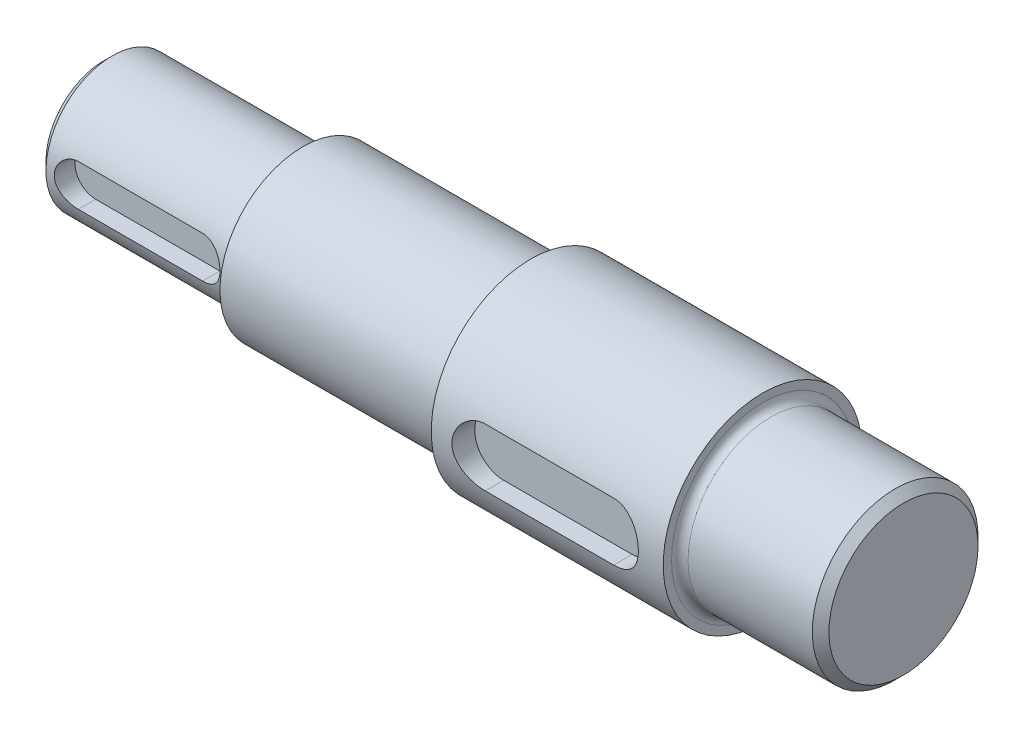
ISO-10303-21;
HEADER;
FILE_DESCRIPTION(('STEP AP214'),'2;1');
FILE_NAME('part.step','',(''),(''),'','','');
FILE_SCHEMA(('AUTOMOTIVE_DESIGN { 1 0 10303 214 1 1 1 1 }'));
ENDSEC;
DATA;
#1=APPLICATION_CONTEXT('core data for automotive mechanical design processes');
#2=APPLICATION_PROTOCOL_DEFINITION('international standard','automotive_design',2000,#1);
#3=PRODUCT_CONTEXT('',#1,'mechanical');
#4=PRODUCT('Part','Part','',(#3));
#5=PRODUCT_RELATED_PRODUCT_CATEGORY('part','',(#4));
#6=PRODUCT_DEFINITION_FORMATION('','',#4);
#7=PRODUCT_DEFINITION_CONTEXT('part definition',#1,'design');
#8=PRODUCT_DEFINITION('design','',#6,#7);
#9=PRODUCT_DEFINITION_SHAPE('','',#8);
#10=(LENGTH_UNIT() NAMED_UNIT(*) SI_UNIT(.MILLI.,.METRE.));
#11=(NAMED_UNIT(*) PLANE_ANGLE_UNIT() SI_UNIT($,.RADIAN.));
#12=(NAMED_UNIT(*) SI_UNIT($,.STERADIAN.) SOLID_ANGLE_UNIT());
#13=UNCERTAINTY_MEASURE_WITH_UNIT(LENGTH_MEASURE(1.E-05),#10,'distance_accuracy_value','');
#14=(GEOMETRIC_REPRESENTATION_CONTEXT(3) GLOBAL_UNCERTAINTY_ASSIGNED_CONTEXT((#13)) GLOBAL_UNIT_ASSIGNED_CONTEXT((#10,
#11,#12)) REPRESENTATION_CONTEXT('',''));
#15=CARTESIAN_POINT('',(0.,0.,0.));
#16=DIRECTION('',(0.,0.,1.));
#17=DIRECTION('',(1.,0.,0.));
#18=AXIS2_PLACEMENT_3D('',#15,#16,#17);
#19=CARTESIAN_POINT('',(0.,0.,0.));
#20=DIRECTION('',(-1.,0.,0.));
#21=DIRECTION('',(0.,-1.,0.));
#22=AXIS2_PLACEMENT_3D('',#19,#20,#21);
#23=PLANE('',#22);
#24=CARTESIAN_POINT('',(0.,0.,0.));
#25=DIRECTION('',(-1.,0.,0.));
#26=DIRECTION('',(0.,-1.,0.));
#27=AXIS2_PLACEMENT_3D('',#24,#25,#26);
#28=CIRCLE('',#27,14.);
#29=CARTESIAN_POINT('',(0.,-14.,0.));
#30=VERTEX_POINT('',#29);
#31=EDGE_CURVE('E162',#30,#30,#28,.T.);
#32=ORIENTED_EDGE('',*,*,#31,.T.);
#33=EDGE_LOOP('',(#32));
#34=FACE_BOUND('',#33,.T.);
#35=ADVANCED_FACE('F33',(#34),#23,.T.);
#36=CARTESIAN_POINT('',(193.,0.,0.));
#37=DIRECTION('',(1.,0.,0.));
#38=DIRECTION('',(0.,1.,0.));
#39=AXIS2_PLACEMENT_3D('',#36,#37,#38);
#40=CYLINDRICAL_SURFACE('',#39,16.);
#41=CARTESIAN_POINT('',(39.,-5.,15.1986841535706));
#42=CARTESIAN_POINT('',(39.1369297177379,-5.00001876402018,15.1986635060155));
#43=CARTESIAN_POINT('',(39.2738515786107,-4.99437589347759,15.2005339376472));
#44=CARTESIAN_POINT('',(39.5466441616812,-4.9719066012981,15.2079058985265));
#45=CARTESIAN_POINT('',(39.6825151292311,-4.95508287500206,15.2134065526431));
#46=CARTESIAN_POINT('',(39.9518756253299,-4.91045141983464,15.2278686056186));
#47=CARTESIAN_POINT('',(40.0853705652593,-4.88267328245064,15.2368206796073));
#48=CARTESIAN_POINT('',(40.3494121913658,-4.81639022533697,15.2579029145887));
#49=CARTESIAN_POINT('',(40.479958789781,-4.77788498675236,15.2700331700498));
#50=CARTESIAN_POINT('',(40.7371387356005,-4.69049837729811,15.2971014107057));
#51=CARTESIAN_POINT('',(40.8637746349516,-4.64162394412445,15.3120375178334));
#52=CARTESIAN_POINT('',(41.1124230254503,-4.5338788859812,15.3442856115609));
#53=CARTESIAN_POINT('',(41.2344337738436,-4.47500453795589,15.3615984825887));
#54=CARTESIAN_POINT('',(41.5923890679799,-4.28398711580932,15.4163884767028));
#55=CARTESIAN_POINT('',(41.8203916857905,-4.13740351463561,15.4567319869187));
#56=CARTESIAN_POINT('',(42.2559520827829,-3.80477014396878,15.5420083062615));
#57=CARTESIAN_POINT('',(42.4626585082763,-3.61763914961478,15.5870445200358));
#58=CARTESIAN_POINT('',(42.8423676526895,-3.21145982301367,15.6757673694125));
#59=CARTESIAN_POINT('',(43.0153645727234,-2.99240601054464,15.7194537717275));
#60=CARTESIAN_POINT('',(43.3264503978223,-2.52249761762138,15.8017432610086));
#61=CARTESIAN_POINT('',(43.4636611267965,-2.27103576512448,15.8402090039262));
#62=CARTESIAN_POINT('',(43.6935071381779,-1.74720631304676,15.9065031203034));
#63=CARTESIAN_POINT('',(43.7861546815474,-1.47484448775402,15.9343344192537));
#64=CARTESIAN_POINT('',(43.921404023007,-0.925860089211049,15.9754868433124));
#65=CARTESIAN_POINT('',(43.9654621090383,-0.649628435012774,15.989229278753));
#66=CARTESIAN_POINT('',(44.0068974314688,-0.0933690149137175,16.0021438524195));
#67=CARTESIAN_POINT('',(44.0042843325814,0.186657953048527,16.0013190072522));
#68=CARTESIAN_POINT('',(43.9534065239998,0.732299589546382,15.9854845726588));
#69=CARTESIAN_POINT('',(43.9067212697878,0.998078033880906,15.9709657627342));
#70=CARTESIAN_POINT('',(43.7716196828297,1.51781473163231,15.9299791073477));
#71=CARTESIAN_POINT('',(43.6832011065194,1.77177234876053,15.9035106194799));
#72=CARTESIAN_POINT('',(43.4661161738423,2.26431537219272,15.8409378140145));
#73=CARTESIAN_POINT('',(43.3369700371082,2.50267435181536,15.8047194262738));
#74=CARTESIAN_POINT('',(43.0425232216915,2.95480608942299,15.726470010495));
#75=CARTESIAN_POINT('',(42.8772137804566,3.16857286940456,15.6844375745929));
#76=CARTESIAN_POINT('',(42.5068863322796,3.57495597883695,15.5969449434458));
#77=CARTESIAN_POINT('',(42.3005029256289,3.76632311133059,15.5514148920093));
#78=CARTESIAN_POINT('',(41.9689743734189,4.02553989626261,15.4855747041344));
#79=CARTESIAN_POINT('',(41.8547196773283,4.10735324144972,15.464023127535));
#80=CARTESIAN_POINT('',(41.6195614218216,4.2611738972957,15.4223452821405));
#81=CARTESIAN_POINT('',(41.4986604849244,4.33318503733555,15.4022184582275));
#82=CARTESIAN_POINT('',(41.249466774637,4.46768370741089,15.3637482945824));
#83=CARTESIAN_POINT('',(41.1211019815447,4.53004475183006,15.3454296242414));
#84=CARTESIAN_POINT('',(40.8592633981691,4.64365087484839,15.3114343470153));
#85=CARTESIAN_POINT('',(40.7257917379939,4.69490052987992,15.2957566529907));
#86=CARTESIAN_POINT('',(40.4547920818445,4.78581076137361,15.2675565411668));
#87=CARTESIAN_POINT('',(40.3172685736427,4.82548366541208,15.2550307689955));
#88=CARTESIAN_POINT('',(40.039118633416,4.89292357731495,15.2335336556111));
#89=CARTESIAN_POINT('',(39.8984936584496,4.92069605575214,15.2245606813372));
#90=CARTESIAN_POINT('',(39.6316869336986,4.96155201839676,15.2112927618778));
#91=CARTESIAN_POINT('',(39.5057286808262,4.97596872830391,15.2065749583153));
#92=CARTESIAN_POINT('',(39.2531834848566,4.9951923004764,15.2002655216957));
#93=CARTESIAN_POINT('',(39.1265976837226,5.00001273345968,15.1986694740171));
#94=CARTESIAN_POINT('',(39.,5.,15.1986841535706));
#95=B_SPLINE_CURVE_WITH_KNOTS('',3,(#41,#42,#43,#44,#45,#46,#47,#48,#49,#50,#51,#52,#53,#54,#55,
#56,#57,#58,#59,#60,#61,#62,#63,#64,#65,#66,#67,#68,#69,#70,#71,#72,#73,#74,#75,#76,#77,#78,#79,
#80,#81,#82,#83,#84,#85,#86,#87,#88,#89,#90,#91,#92,#93,#94),.UNSPECIFIED.,.F.,.F.,(4,2,2,2,2,2,
2,2,2,2,2,2,2,2,2,2,2,2,2,2,2,2,2,2,2,2,4),(0.,0.410647919758043,0.821196881542668,
1.23064432922751,1.64010394872541,2.04929047101912,2.45862967230994,3.2768827913103,
4.12046514534441,4.96419248897058,5.82700574327198,6.6895814701031,7.52553600517322,
8.36131743199138,9.16823951381226,9.97520498033131,10.7920560572179,11.609105280929,
12.4601312020614,12.8862315051731,13.3121648650028,13.7432787284905,14.1742146909751,
14.6046900798641,15.0349673682784,15.4151752920152,15.7948451560185),.UNSPECIFIED.);
#96=CARTESIAN_POINT('',(39.,-5.,15.1986841535706));
#97=VERTEX_POINT('',#96);
#98=CARTESIAN_POINT('',(39.,5.,15.1986841535706));
#99=VERTEX_POINT('',#98);
#100=EDGE_CURVE('E189',#97,#99,#95,.T.);
#101=ORIENTED_EDGE('',*,*,#100,.F.);
#102=DIRECTION('',(1.,0.,0.));
#103=VECTOR('',#102,1.);
#104=CARTESIAN_POINT('',(193.,-5.,15.1986841535706));
#105=LINE('',#104,#103);
#106=CARTESIAN_POINT('',(9.,-5.,15.1986841535706));
#107=VERTEX_POINT('',#106);
#108=EDGE_CURVE('E226',#107,#97,#105,.T.);
#109=ORIENTED_EDGE('',*,*,#108,.F.);
#110=CARTESIAN_POINT('',(9.,5.,15.1986841535706));
#111=CARTESIAN_POINT('',(8.8630702822621,5.00001876402018,15.1986635060155));
#112=CARTESIAN_POINT('',(8.7261484213893,4.99437589347759,15.2005339376472));
#113=CARTESIAN_POINT('',(8.45335583831884,4.9719066012981,15.2079058985265));
#114=CARTESIAN_POINT('',(8.31748487076893,4.95508287500206,15.2134065526431));
#115=CARTESIAN_POINT('',(8.04812437467006,4.91045141983464,15.2278686056186));
#116=CARTESIAN_POINT('',(7.91462943474071,4.88267328245064,15.2368206796073));
#117=CARTESIAN_POINT('',(7.6505878086342,4.81639022533697,15.2579029145887));
#118=CARTESIAN_POINT('',(7.52004121021898,4.77788498675236,15.2700331700498));
#119=CARTESIAN_POINT('',(7.26286126439948,4.69049837729811,15.2971014107057));
#120=CARTESIAN_POINT('',(7.13622536504842,4.64162394412445,15.3120375178334));
#121=CARTESIAN_POINT('',(6.88757697454968,4.5338788859812,15.3442856115609));
#122=CARTESIAN_POINT('',(6.76556622615643,4.47500453795589,15.3615984825887));
#123=CARTESIAN_POINT('',(6.4076109320201,4.28398711580932,15.4163884767028));
#124=CARTESIAN_POINT('',(6.17960831420954,4.13740351463561,15.4567319869187));
#125=CARTESIAN_POINT('',(5.74404791721714,3.80477014396878,15.5420083062615));
#126=CARTESIAN_POINT('',(5.53734149172373,3.61763914961478,15.5870445200358));
#127=CARTESIAN_POINT('',(5.15763234731053,3.21145982301367,15.6757673694125));
#128=CARTESIAN_POINT('',(4.98463542727657,2.99240601054464,15.7194537717275));
#129=CARTESIAN_POINT('',(4.67354960217775,2.52249761762139,15.8017432610086));
#130=CARTESIAN_POINT('',(4.53633887320348,2.27103576512448,15.8402090039262));
#131=CARTESIAN_POINT('',(4.30649286182209,1.74720631304676,15.9065031203034));
#132=CARTESIAN_POINT('',(4.21384531845258,1.47484448775402,15.9343344192537));
#133=CARTESIAN_POINT('',(4.07859597699295,0.925860089211048,15.9754868433124));
#134=CARTESIAN_POINT('',(4.03453789096175,0.649628435012773,15.989229278753));
#135=CARTESIAN_POINT('',(3.99310256853123,0.0933690149137168,16.0021438524195));
#136=CARTESIAN_POINT('',(3.9957156674186,-0.186657953048528,16.0013190072522));
#137=CARTESIAN_POINT('',(4.04659347600016,-0.732299589546383,15.9854845726588));
#138=CARTESIAN_POINT('',(4.09327873021216,-0.998078033880907,15.9709657627342));
#139=CARTESIAN_POINT('',(4.22838031717034,-1.51781473163231,15.9299791073477));
#140=CARTESIAN_POINT('',(4.31679889348055,-1.77177234876053,15.9035106194799));
#141=CARTESIAN_POINT('',(4.5338838261577,-2.26431537219271,15.8409378140145));
#142=CARTESIAN_POINT('',(4.66302996289177,-2.50267435181536,15.8047194262738));
#143=CARTESIAN_POINT('',(4.95747677830852,-2.95480608942299,15.726470010495));
#144=CARTESIAN_POINT('',(5.12278621954343,-3.16857286940456,15.6844375745929));
#145=CARTESIAN_POINT('',(5.49311366772036,-3.57495597883695,15.5969449434458));
#146=CARTESIAN_POINT('',(5.69949707437115,-3.76632311133059,15.5514148920093));
#147=CARTESIAN_POINT('',(6.03102562658113,-4.02553989626261,15.4855747041344));
#148=CARTESIAN_POINT('',(6.14528032267166,-4.10735324144972,15.464023127535));
#149=CARTESIAN_POINT('',(6.38043857817843,-4.2611738972957,15.4223452821405));
#150=CARTESIAN_POINT('',(6.50133951507565,-4.33318503733555,15.4022184582275));
#151=CARTESIAN_POINT('',(6.75053322536304,-4.46768370741089,15.3637482945824));
#152=CARTESIAN_POINT('',(6.87889801845526,-4.53004475183006,15.3454296242414));
#153=CARTESIAN_POINT('',(7.14073660183092,-4.64365087484838,15.3114343470153));
#154=CARTESIAN_POINT('',(7.27420826200614,-4.69490052987992,15.2957566529907));
#155=CARTESIAN_POINT('',(7.54520791815553,-4.78581076137362,15.2675565411668));
#156=CARTESIAN_POINT('',(7.68273142635728,-4.82548366541209,15.2550307689955));
#157=CARTESIAN_POINT('',(7.960881366584,-4.89292357731496,15.2335336556111));
#158=CARTESIAN_POINT('',(8.10150634155039,-4.92069605575214,15.2245606813372));
#159=CARTESIAN_POINT('',(8.36831306630137,-4.96155201839676,15.2112927618778));
#160=CARTESIAN_POINT('',(8.49427131917377,-4.97596872830391,15.2065749583152));
#161=CARTESIAN_POINT('',(8.74681651514341,-4.9951923004764,15.2002655216957));
#162=CARTESIAN_POINT('',(8.87340231627745,-5.00001273345967,15.1986694740171));
#163=CARTESIAN_POINT('',(9.,-5.,15.1986841535706));
#164=B_SPLINE_CURVE_WITH_KNOTS('',3,(#110,#111,#112,#113,#114,#115,#116,#117,#118,#119,#120,
#121,#122,#123,#124,#125,#126,#127,#128,#129,#130,#131,#132,#133,#134,#135,#136,#137,#138,#139,
#140,#141,#142,#143,#144,#145,#146,#147,#148,#149,#150,#151,#152,#153,#154,#155,#156,#157,#158,
#159,#160,#161,#162,#163),.UNSPECIFIED.,.F.,.F.,(4,2,2,2,2,2,2,2,2,2,2,2,2,2,2,2,2,2,2,2,2,2,2,
2,2,2,4),(0.,0.410647919758039,0.821196881542667,1.23064432922751,1.64010394872541,
2.04929047101912,2.45862967230994,3.2768827913103,4.12046514534441,4.96419248897058,
5.82700574327198,6.6895814701031,7.52553600517322,8.36131743199138,9.16823951381226,
9.97520498033131,10.7920560572179,11.609105280929,12.4601312020614,12.8862315051731,
13.3121648650028,13.7432787284905,14.1742146909751,14.6046900798641,15.0349673682784,
15.4151752920152,15.7948451560185),.UNSPECIFIED.);
#165=CARTESIAN_POINT('',(9.,5.,15.1986841535706));
#166=VERTEX_POINT('',#165);
#167=EDGE_CURVE('E221',#166,#107,#164,.T.);
#168=ORIENTED_EDGE('',*,*,#167,.F.);
#169=DIRECTION('',(1.,0.,0.));
#170=VECTOR('',#169,1.);
#171=CARTESIAN_POINT('',(193.,5.,15.1986841535706));
#172=LINE('',#171,#170);
#173=EDGE_CURVE('E196',#99,#166,#172,.F.);
#174=ORIENTED_EDGE('',*,*,#173,.F.);
#175=EDGE_LOOP('',(#101,#109,#168,#174));
#176=FACE_BOUND('',#175,.T.);
#177=CARTESIAN_POINT('',(46.,0.,0.));
#178=DIRECTION('',(-1.,0.,0.));
#179=DIRECTION('',(0.,-1.,0.));
#180=AXIS2_PLACEMENT_3D('',#177,#178,#179);
#181=CIRCLE('',#180,16.);
#182=CARTESIAN_POINT('',(46.,-16.,0.));
#183=VERTEX_POINT('',#182);
#184=EDGE_CURVE('E174',#183,#183,#181,.T.);
#185=ORIENTED_EDGE('',*,*,#184,.T.);
#186=EDGE_LOOP('',(#185));
#187=FACE_BOUND('',#186,.T.);
#188=CARTESIAN_POINT('',(2.,0.,0.));
#189=DIRECTION('',(-1.,0.,0.));
#190=DIRECTION('',(0.,-1.,0.));
#191=AXIS2_PLACEMENT_3D('',#188,#189,#190);
#192=CIRCLE('',#191,16.);
#193=CARTESIAN_POINT('',(2.,-16.,0.));
#194=VERTEX_POINT('',#193);
#195=EDGE_CURVE('E159',#194,#194,#192,.F.);
#196=ORIENTED_EDGE('',*,*,#195,.T.);
#197=EDGE_LOOP('',(#196));
#198=FACE_BOUND('',#197,.T.);
#199=ADVANCED_FACE('F198',(#176,#187,#198),#40,.T.);
#200=CARTESIAN_POINT('',(48.,16.,0.));
#201=DIRECTION('',(-1.,0.,0.));
#202=DIRECTION('',(0.,-1.,0.));
#203=AXIS2_PLACEMENT_3D('',#200,#201,#202);
#204=PLANE('',#203);
#205=CARTESIAN_POINT('',(48.,0.,0.));
#206=DIRECTION('',(-1.,0.,0.));
#207=DIRECTION('',(0.,-1.,0.));
#208=AXIS2_PLACEMENT_3D('',#205,#206,#207);
#209=CIRCLE('',#208,18.);
#210=CARTESIAN_POINT('',(48.,-18.,0.));
#211=VERTEX_POINT('',#210);
#212=EDGE_CURVE('E171',#211,#211,#209,.F.);
#213=ORIENTED_EDGE('',*,*,#212,.T.);
#214=EDGE_LOOP('',(#213));
#215=FACE_BOUND('',#214,.T.);
#216=CARTESIAN_POINT('',(48.,0.,0.));
#217=DIRECTION('',(1.,0.,0.));
#218=DIRECTION('',(0.,1.,0.));
#219=AXIS2_PLACEMENT_3D('',#216,#217,#218);
#220=CIRCLE('',#219,20.);
#221=CARTESIAN_POINT('',(48.,20.,0.));
#222=VERTEX_POINT('',#221);
#223=EDGE_CURVE('E156',#222,#222,#220,.T.);
#224=ORIENTED_EDGE('',*,*,#223,.F.);
#225=EDGE_LOOP('',(#224));
#226=FACE_BOUND('',#225,.T.);
#227=ADVANCED_FACE('F281',(#215,#226),#204,.T.);
#228=CARTESIAN_POINT('',(193.,0.,0.));
#229=DIRECTION('',(1.,0.,0.));
#230=DIRECTION('',(0.,1.,0.));
#231=AXIS2_PLACEMENT_3D('',#228,#229,#230);
#232=CYLINDRICAL_SURFACE('',#231,20.);
#233=CARTESIAN_POINT('',(101.,0.,0.));
#234=DIRECTION('',(-1.,0.,0.));
#235=DIRECTION('',(0.,-1.,0.));
#236=AXIS2_PLACEMENT_3D('',#233,#234,#235);
#237=CIRCLE('',#236,20.);
#238=CARTESIAN_POINT('',(101.,-20.,0.));
#239=VERTEX_POINT('',#238);
#240=EDGE_CURVE('E180',#239,#239,#237,.T.);
#241=ORIENTED_EDGE('',*,*,#240,.T.);
#242=EDGE_LOOP('',(#241));
#243=FACE_BOUND('',#242,.T.);
#244=ORIENTED_EDGE('',*,*,#223,.T.);
#245=EDGE_LOOP('',(#244));
#246=FACE_BOUND('',#245,.T.);
#247=ADVANCED_FACE('F308',(#243,#246),#232,.T.);
#248=CARTESIAN_POINT('',(103.,20.,0.));
#249=DIRECTION('',(-1.,0.,0.));
#250=DIRECTION('',(0.,-1.,0.));
#251=AXIS2_PLACEMENT_3D('',#248,#249,#250);
#252=PLANE('',#251);
#253=CARTESIAN_POINT('',(103.,0.,0.));
#254=DIRECTION('',(-1.,0.,0.));
#255=DIRECTION('',(0.,-1.,0.));
#256=AXIS2_PLACEMENT_3D('',#253,#254,#255);
#257=CIRCLE('',#256,22.);
#258=CARTESIAN_POINT('',(103.,-22.,0.));
#259=VERTEX_POINT('',#258);
#260=EDGE_CURVE('E177',#259,#259,#257,.F.);
#261=ORIENTED_EDGE('',*,*,#260,.T.);
#262=EDGE_LOOP('',(#261));
#263=FACE_BOUND('',#262,.T.);
#264=CARTESIAN_POINT('',(103.,0.,0.));
#265=DIRECTION('',(1.,0.,0.));
#266=DIRECTION('',(0.,1.,0.));
#267=AXIS2_PLACEMENT_3D('',#264,#265,#266);
#268=CIRCLE('',#267,24.);
#269=CARTESIAN_POINT('',(103.,24.,0.));
#270=VERTEX_POINT('',#269);
#271=EDGE_CURVE('E153',#270,#270,#268,.T.);
#272=ORIENTED_EDGE('',*,*,#271,.F.);
#273=EDGE_LOOP('',(#272));
#274=FACE_BOUND('',#273,.T.);
#275=ADVANCED_FACE('F262',(#263,#274),#252,.T.);
#276=CARTESIAN_POINT('',(193.,0.,0.));
#277=DIRECTION('',(1.,0.,0.));
#278=DIRECTION('',(0.,1.,0.));
#279=AXIS2_PLACEMENT_3D('',#276,#277,#278);
#280=CYLINDRICAL_SURFACE('',#279,24.);
#281=CARTESIAN_POINT('',(146.,-7.,22.956480566498));
#282=CARTESIAN_POINT('',(146.192377017042,-7.00002575966466,22.95645389589));
#283=CARTESIAN_POINT('',(146.384744405618,-6.99207068648228,22.9588978693371));
#284=CARTESIAN_POINT('',(146.768016412493,-6.96038940268603,22.9685324694914));
#285=CARTESIAN_POINT('',(146.958921335683,-6.93666657509225,22.9757220780058));
#286=CARTESIAN_POINT('',(147.337448101452,-6.87371674659299,22.9946304639627));
#287=CARTESIAN_POINT('',(147.525076795311,-6.83452756535011,23.0063381917734));
#288=CARTESIAN_POINT('',(147.896205910115,-6.74099543191875,23.0339178389727));
#289=CARTESIAN_POINT('',(148.079706232368,-6.68665211787473,23.0497898577972));
#290=CARTESIAN_POINT('',(148.441226177189,-6.56329769920769,23.0852166974821));
#291=CARTESIAN_POINT('',(148.619248700622,-6.49429451653387,23.1047695286453));
#292=CARTESIAN_POINT('',(148.96882021787,-6.34211797948412,23.1470035642304));
#293=CARTESIAN_POINT('',(149.140366775705,-6.25893935653199,23.1696859312057));
#294=CARTESIAN_POINT('',(149.475844489878,-6.07904056277584,23.2175348468332));
#295=CARTESIAN_POINT('',(149.639775468821,-5.98232007674329,23.2427014533097));
#296=CARTESIAN_POINT('',(149.959081771007,-5.77596928247642,23.2948385691885));
#297=CARTESIAN_POINT('',(150.114453831931,-5.66633410096575,23.3218097578692));
#298=CARTESIAN_POINT('',(150.419653938051,-5.43182024859132,23.3775583295902));
#299=CARTESIAN_POINT('',(150.569225104074,-5.3066140336209,23.4063646594586));
#300=CARTESIAN_POINT('',(150.857417231184,-5.04415474403587,23.4643253900033));
#301=CARTESIAN_POINT('',(150.996034360862,-4.90689748943723,23.4934799083975));
#302=CARTESIAN_POINT('',(151.261379060091,-4.62124345801019,23.551334153623));
#303=CARTESIAN_POINT('',(151.38810658501,-4.47284663936941,23.5800338787467));
#304=CARTESIAN_POINT('',(151.628833327748,-4.16584741463492,23.6362023651967));
#305=CARTESIAN_POINT('',(151.742832642135,-4.00724508598472,23.6636711358613));
#306=CARTESIAN_POINT('',(151.959429493054,-3.67761507053094,23.7171576318518));
#307=CARTESIAN_POINT('',(152.061758137286,-3.5064041424394,23.7431361056055));
#308=CARTESIAN_POINT('',(152.251542687836,-3.15562428711047,23.7922967546624));
#309=CARTESIAN_POINT('',(152.339004075584,-2.97605847148552,23.8154799596367));
#310=CARTESIAN_POINT('',(152.498404667704,-2.60972139886196,23.8584024425949));
#311=CARTESIAN_POINT('',(152.570340905601,-2.42294877284136,23.8781410622655));
#312=CARTESIAN_POINT('',(152.69802015909,-2.04366008250954,23.9135884036831));
#313=CARTESIAN_POINT('',(152.753770112628,-1.85114651807803,23.9292988516914));
#314=CARTESIAN_POINT('',(152.847340144509,-1.46695963219767,23.9558783824457));
#315=CARTESIAN_POINT('',(152.885599833102,-1.27540151296482,23.9668656974275));
#316=CARTESIAN_POINT('',(152.945981709264,-0.889627827384881,23.9842828598795));
#317=CARTESIAN_POINT('',(152.968110296579,-0.695413346093669,23.9907145147029));
#318=CARTESIAN_POINT('',(152.996049437628,-0.305707484706372,23.9988443193323));
#319=CARTESIAN_POINT('',(153.001859352105,-0.110216054888556,24.0005422837037));
#320=CARTESIAN_POINT('',(152.997104422758,0.280548759151212,23.9991554941984));
#321=CARTESIAN_POINT('',(152.986539861613,0.475822147079082,23.9960708228865));
#322=CARTESIAN_POINT('',(152.949704826316,0.858763532682911,23.9853726262241));
#323=CARTESIAN_POINT('',(152.923920749377,1.04648248545087,23.9778993905009));
#324=CARTESIAN_POINT('',(152.85726413557,1.41906880599863,23.9587364617742));
#325=CARTESIAN_POINT('',(152.816386450306,1.60393517832813,23.9470453300869));
#326=CARTESIAN_POINT('',(152.719903423386,1.96941849285668,23.9197609510502));
#327=CARTESIAN_POINT('',(152.664303029491,2.15003684049847,23.9041690147145));
#328=CARTESIAN_POINT('',(152.538792137871,2.50595693179476,23.8694819029225));
#329=CARTESIAN_POINT('',(152.468876264634,2.68125664981075,23.8503854117738));
#330=CARTESIAN_POINT('',(152.314445165454,3.02721927819267,23.80896106074));
#331=CARTESIAN_POINT('',(152.229779507473,3.19781107480364,23.7866003326643));
#332=CARTESIAN_POINT('',(152.046975284076,3.53132644746546,23.7393789651262));
#333=CARTESIAN_POINT('',(151.948832091867,3.6942473642233,23.7145174679453));
#334=CARTESIAN_POINT('',(151.739774719816,4.01136557714415,23.662940560499));
#335=CARTESIAN_POINT('',(151.62886052128,4.16556286053639,23.6362251475197));
#336=CARTESIAN_POINT('',(151.394986495971,4.46431529273863,23.5816232052155));
#337=CARTESIAN_POINT('',(151.272026338257,4.60887017645667,23.5537366437272));
#338=CARTESIAN_POINT('',(151.01011421207,4.89258412268109,23.4964747635981));
#339=CARTESIAN_POINT('',(150.870741433699,5.03135155010395,23.4670823297621));
#340=CARTESIAN_POINT('',(150.580829611997,5.29665913789578,23.4086277473022));
#341=CARTESIAN_POINT('',(150.430294193434,5.42320323699322,23.3795654949653));
#342=CARTESIAN_POINT('',(150.118871485937,5.66335466900479,23.3225568752573));
#343=CARTESIAN_POINT('',(149.957977422517,5.77695339843099,23.2946112579195));
#344=CARTESIAN_POINT('',(149.627020752468,5.99028088545064,23.2406678033365));
#345=CARTESIAN_POINT('',(149.456961741021,6.09001502761001,23.2146692117481));
#346=CARTESIAN_POINT('',(149.107052428248,6.27581375687662,23.1651354388814));
#347=CARTESIAN_POINT('',(148.927123806809,6.36173793342892,23.1416263007237));
#348=CARTESIAN_POINT('',(148.560303511068,6.51801910772587,23.098095352465));
#349=CARTESIAN_POINT('',(148.37341470872,6.58838244492252,23.0780721229225));
#350=CARTESIAN_POINT('',(147.994146761326,6.71291098283026,23.0421576373197));
#351=CARTESIAN_POINT('',(147.801773603374,6.76709315817447,23.0262620535088));
#352=CARTESIAN_POINT('',(147.41286565597,6.85884146824021,22.9990994939156));
#353=CARTESIAN_POINT('',(147.216332835197,6.89641528688285,22.9878303778522));
#354=CARTESIAN_POINT('',(146.849895374392,6.95030205694016,22.9715911687078));
#355=CARTESIAN_POINT('',(146.680359085623,6.96894003353268,22.965935239902));
#356=CARTESIAN_POINT('',(146.340552928733,6.99378672629829,22.9583749002177));
#357=CARTESIAN_POINT('',(146.17028455135,7.00001413311573,22.9564648480198));
#358=CARTESIAN_POINT('',(146.,7.,22.956480566498));
#359=B_SPLINE_CURVE_WITH_KNOTS('',3,(#281,#282,#283,#284,#285,#286,#287,#288,#289,#290,#291,
#292,#293,#294,#295,#296,#297,#298,#299,#300,#301,#302,#303,#304,#305,#306,#307,#308,#309,#310,
#311,#312,#313,#314,#315,#316,#317,#318,#319,#320,#321,#322,#323,#324,#325,#326,#327,#328,#329,
#330,#331,#332,#333,#334,#335,#336,#337,#338,#339,#340,#341,#342,#343,#344,#345,#346,#347,#348,
#349,#350,#351,#352,#353,#354,#355,#356,#357,#358),.UNSPECIFIED.,.F.,.F.,(4,2,2,2,2,2,2,2,2,2,2,
2,2,2,2,2,2,2,2,2,2,2,2,2,2,2,2,2,2,2,2,2,2,2,2,2,2,2,4),(0.,0.576936312150283,1.15374888078415,
1.72915963089136,2.30458412202906,2.87969845068401,3.45502699972622,4.0303689435374,
4.60592868856402,5.19677636179465,5.7878297903136,6.37888543746381,6.96993659997458,
7.57263278244223,8.17510627177614,8.77769477727643,9.38002461197053,9.96624701293704,
10.5522367132199,11.1382493683848,11.7242519070611,12.2924695734608,12.8608812369626,
13.4291021201545,13.997536764898,14.5721502124455,15.1469614183888,15.7217734657935,
16.2966013096086,16.8924861271703,17.4881782874434,18.0842640636637,18.6801176884375,
19.2816911764404,19.8830191313793,20.4837140372878,21.0841307377182,21.5956008174164,
22.1063000258608),.UNSPECIFIED.);
#360=CARTESIAN_POINT('',(146.,-7.,22.956480566498));
#361=VERTEX_POINT('',#360);
#362=CARTESIAN_POINT('',(146.,7.,22.956480566498));
#363=VERTEX_POINT('',#362);
#364=EDGE_CURVE('E228',#361,#363,#359,.T.);
#365=ORIENTED_EDGE('',*,*,#364,.F.);
#366=DIRECTION('',(1.,0.,0.));
#367=VECTOR('',#366,1.);
#368=CARTESIAN_POINT('',(193.,-7.,22.956480566498));
#369=LINE('',#368,#367);
#370=CARTESIAN_POINT('',(115.,-7.,22.956480566498));
#371=VERTEX_POINT('',#370);
#372=EDGE_CURVE('E11',#371,#361,#369,.T.);
#373=ORIENTED_EDGE('',*,*,#372,.F.);
#374=CARTESIAN_POINT('',(115.,7.,22.956480566498));
#375=CARTESIAN_POINT('',(114.807622982958,7.00002575966466,22.95645389589));
#376=CARTESIAN_POINT('',(114.615255594382,6.99207068648228,22.9588978693371));
#377=CARTESIAN_POINT('',(114.231983587507,6.96038940268603,22.9685324694914));
#378=CARTESIAN_POINT('',(114.041078664317,6.93666657509226,22.9757220780058));
#379=CARTESIAN_POINT('',(113.662551898548,6.87371674659299,22.9946304639627));
#380=CARTESIAN_POINT('',(113.474923204689,6.83452756535012,23.0063381917734));
#381=CARTESIAN_POINT('',(113.103794089885,6.74099543191876,23.0339178389727));
#382=CARTESIAN_POINT('',(112.920293767632,6.68665211787473,23.0497898577972));
#383=CARTESIAN_POINT('',(112.558773822811,6.56329769920769,23.0852166974821));
#384=CARTESIAN_POINT('',(112.380751299378,6.49429451653387,23.1047695286453));
#385=CARTESIAN_POINT('',(112.03117978213,6.34211797948412,23.1470035642304));
#386=CARTESIAN_POINT('',(111.859633224295,6.25893935653199,23.1696859312057));
#387=CARTESIAN_POINT('',(111.524155510122,6.07904056277584,23.2175348468332));
#388=CARTESIAN_POINT('',(111.360224531179,5.98232007674329,23.2427014533097));
#389=CARTESIAN_POINT('',(111.040918228993,5.77596928247643,23.2948385691885));
#390=CARTESIAN_POINT('',(110.885546168069,5.66633410096576,23.3218097578692));
#391=CARTESIAN_POINT('',(110.580346061949,5.43182024859133,23.3775583295902));
#392=CARTESIAN_POINT('',(110.430774895926,5.3066140336209,23.4063646594586));
#393=CARTESIAN_POINT('',(110.142582768816,5.04415474403587,23.4643253900033));
#394=CARTESIAN_POINT('',(110.003965639138,4.90689748943723,23.4934799083975));
#395=CARTESIAN_POINT('',(109.738620939909,4.62124345801019,23.551334153623));
#396=CARTESIAN_POINT('',(109.61189341499,4.47284663936941,23.5800338787467));
#397=CARTESIAN_POINT('',(109.371166672252,4.16584741463492,23.6362023651967));
#398=CARTESIAN_POINT('',(109.257167357865,4.00724508598471,23.6636711358613));
#399=CARTESIAN_POINT('',(109.040570506946,3.67761507053094,23.7171576318518));
#400=CARTESIAN_POINT('',(108.938241862714,3.5064041424394,23.7431361056055));
#401=CARTESIAN_POINT('',(108.748457312164,3.15562428711047,23.7922967546624));
#402=CARTESIAN_POINT('',(108.660995924416,2.97605847148551,23.8154799596367));
#403=CARTESIAN_POINT('',(108.501595332296,2.60972139886195,23.8584024425949));
#404=CARTESIAN_POINT('',(108.429659094399,2.42294877284135,23.8781410622655));
#405=CARTESIAN_POINT('',(108.30197984091,2.04366008250953,23.9135884036831));
#406=CARTESIAN_POINT('',(108.246229887372,1.85114651807802,23.9292988516914));
#407=CARTESIAN_POINT('',(108.152659855491,1.46695963219767,23.9558783824457));
#408=CARTESIAN_POINT('',(108.114400166898,1.27540151296482,23.9668656974275));
#409=CARTESIAN_POINT('',(108.054018290736,0.889627827384876,23.9842828598795));
#410=CARTESIAN_POINT('',(108.031889703421,0.695413346093665,23.9907145147029));
#411=CARTESIAN_POINT('',(108.003950562372,0.30570748470637,23.9988443193323));
#412=CARTESIAN_POINT('',(107.998140647895,0.110216054888554,24.0005422837037));
#413=CARTESIAN_POINT('',(108.002895577242,-0.280548759151213,23.9991554941984));
#414=CARTESIAN_POINT('',(108.013460138387,-0.475822147079082,23.9960708228865));
#415=CARTESIAN_POINT('',(108.050295173684,-0.85876353268291,23.9853726262241));
#416=CARTESIAN_POINT('',(108.076079250623,-1.04648248545087,23.9778993905009));
#417=CARTESIAN_POINT('',(108.14273586443,-1.41906880599863,23.9587364617742));
#418=CARTESIAN_POINT('',(108.183613549694,-1.60393517832813,23.9470453300869));
#419=CARTESIAN_POINT('',(108.280096576613,-1.96941849285668,23.9197609510502));
#420=CARTESIAN_POINT('',(108.335696970509,-2.15003684049847,23.9041690147145));
#421=CARTESIAN_POINT('',(108.461207862129,-2.50595693179476,23.8694819029225));
#422=CARTESIAN_POINT('',(108.531123735366,-2.68125664981075,23.8503854117738));
#423=CARTESIAN_POINT('',(108.685554834546,-3.02721927819268,23.80896106074));
#424=CARTESIAN_POINT('',(108.770220492527,-3.19781107480365,23.7866003326643));
#425=CARTESIAN_POINT('',(108.953024715924,-3.53132644746547,23.7393789651262));
#426=CARTESIAN_POINT('',(109.051167908133,-3.6942473642233,23.7145174679453));
#427=CARTESIAN_POINT('',(109.260225280184,-4.01136557714416,23.662940560499));
#428=CARTESIAN_POINT('',(109.37113947872,-4.1655628605364,23.6362251475197));
#429=CARTESIAN_POINT('',(109.605013504029,-4.46431529273863,23.5816232052155));
#430=CARTESIAN_POINT('',(109.727973661743,-4.60887017645667,23.5537366437272));
#431=CARTESIAN_POINT('',(109.98988578793,-4.89258412268109,23.4964747635981));
#432=CARTESIAN_POINT('',(110.129258566301,-5.03135155010394,23.4670823297621));
#433=CARTESIAN_POINT('',(110.419170388003,-5.29665913789578,23.4086277473022));
#434=CARTESIAN_POINT('',(110.569705806566,-5.42320323699322,23.3795654949653));
#435=CARTESIAN_POINT('',(110.881128514063,-5.66335466900479,23.3225568752573));
#436=CARTESIAN_POINT('',(111.042022577483,-5.77695339843098,23.2946112579195));
#437=CARTESIAN_POINT('',(111.372979247532,-5.99028088545063,23.2406678033365));
#438=CARTESIAN_POINT('',(111.543038258979,-6.09001502761001,23.2146692117481));
#439=CARTESIAN_POINT('',(111.892947571752,-6.27581375687662,23.1651354388814));
#440=CARTESIAN_POINT('',(112.072876193191,-6.36173793342891,23.1416263007237));
#441=CARTESIAN_POINT('',(112.439696488932,-6.51801910772586,23.098095352465));
#442=CARTESIAN_POINT('',(112.62658529128,-6.58838244492251,23.0780721229225));
#443=CARTESIAN_POINT('',(113.005853238674,-6.71291098283026,23.0421576373197));
#444=CARTESIAN_POINT('',(113.198226396626,-6.76709315817446,23.0262620535088));
#445=CARTESIAN_POINT('',(113.58713434403,-6.8588414682402,22.9990994939156));
#446=CARTESIAN_POINT('',(113.783667164803,-6.89641528688285,22.9878303778522));
#447=CARTESIAN_POINT('',(114.150104625608,-6.95030205694016,22.9715911687078));
#448=CARTESIAN_POINT('',(114.319640914377,-6.96894003353268,22.965935239902));
#449=CARTESIAN_POINT('',(114.659447071267,-6.99378672629829,22.9583749002177));
#450=CARTESIAN_POINT('',(114.82971544865,-7.00001413311573,22.9564648480198));
#451=CARTESIAN_POINT('',(115.,-7.,22.956480566498));
#452=B_SPLINE_CURVE_WITH_KNOTS('',3,(#374,#375,#376,#377,#378,#379,#380,#381,#382,#383,#384,
#385,#386,#387,#388,#389,#390,#391,#392,#393,#394,#395,#396,#397,#398,#399,#400,#401,#402,#403,
#404,#405,#406,#407,#408,#409,#410,#411,#412,#413,#414,#415,#416,#417,#418,#419,#420,#421,#422,
#423,#424,#425,#426,#427,#428,#429,#430,#431,#432,#433,#434,#435,#436,#437,#438,#439,#440,#441,
#442,#443,#444,#445,#446,#447,#448,#449,#450,#451),.UNSPECIFIED.,.F.,.F.,(4,2,2,2,2,2,2,2,2,2,2,
2,2,2,2,2,2,2,2,2,2,2,2,2,2,2,2,2,2,2,2,2,2,2,2,2,2,2,4),(0.,0.576936312150227,1.15374888078414,
1.72915963089133,2.30458412202906,2.87969845068403,3.4550269997262,4.03036894353739,
4.60592868856402,5.19677636179463,5.78782979031361,6.37888543746382,6.9699365999746,
7.57263278244224,8.17510627177614,8.77769477727645,9.38002461197054,9.96624701293705,
10.5522367132199,11.1382493683848,11.7242519070611,12.2924695734608,12.8608812369626,
13.4291021201546,13.997536764898,14.5721502124455,15.1469614183888,15.7217734657935,
16.2966013096086,16.8924861271703,17.4881782874434,18.0842640636637,18.6801176884376,
19.2816911764404,19.8830191313792,20.4837140372878,21.0841307377182,21.5956008174165,
22.1063000258608),.UNSPECIFIED.);
#453=CARTESIAN_POINT('',(115.,7.,22.956480566498));
#454=VERTEX_POINT('',#453);
#455=EDGE_CURVE('E41',#454,#371,#452,.T.);
#456=ORIENTED_EDGE('',*,*,#455,.F.);
#457=DIRECTION('',(1.,0.,0.));
#458=VECTOR('',#457,1.);
#459=CARTESIAN_POINT('',(193.,7.,22.956480566498));
#460=LINE('',#459,#458);
#461=EDGE_CURVE('E235',#363,#454,#460,.F.);
#462=ORIENTED_EDGE('',*,*,#461,.F.);
#463=EDGE_LOOP('',(#365,#373,#456,#462));
#464=FACE_BOUND('',#463,.T.);
#465=ORIENTED_EDGE('',*,*,#271,.T.);
#466=EDGE_LOOP('',(#465));
#467=FACE_BOUND('',#466,.T.);
#468=CARTESIAN_POINT('',(159.,0.,0.));
#469=DIRECTION('',(1.,0.,0.));
#470=DIRECTION('',(0.,1.,0.));
#471=AXIS2_PLACEMENT_3D('',#468,#469,#470);
#472=CIRCLE('',#471,24.);
#473=CARTESIAN_POINT('',(159.,24.,0.));
#474=VERTEX_POINT('',#473);
#475=EDGE_CURVE('E143',#474,#474,#472,.T.);
#476=ORIENTED_EDGE('',*,*,#475,.F.);
#477=EDGE_LOOP('',(#476));
#478=FACE_BOUND('',#477,.T.);
#479=ADVANCED_FACE('F236',(#464,#467,#478),#280,.T.);
#480=CARTESIAN_POINT('',(159.,24.,0.));
#481=DIRECTION('',(1.,0.,0.));
#482=DIRECTION('',(0.,1.,0.));
#483=AXIS2_PLACEMENT_3D('',#480,#481,#482);
#484=PLANE('',#483);
#485=CARTESIAN_POINT('',(159.,0.,0.));
#486=DIRECTION('',(1.,0.,0.));
#487=DIRECTION('',(0.,1.,0.));
#488=AXIS2_PLACEMENT_3D('',#485,#486,#487);
#489=CIRCLE('',#488,22.);
#490=CARTESIAN_POINT('',(159.,22.,0.));
#491=VERTEX_POINT('',#490);
#492=EDGE_CURVE('E186',#491,#491,#489,.F.);
#493=ORIENTED_EDGE('',*,*,#492,.T.);
#494=EDGE_LOOP('',(#493));
#495=FACE_BOUND('',#494,.T.);
#496=ORIENTED_EDGE('',*,*,#475,.T.);
#497=EDGE_LOOP('',(#496));
#498=FACE_BOUND('',#497,.T.);
#499=ADVANCED_FACE('F261',(#495,#498),#484,.T.);
#500=CARTESIAN_POINT('',(193.,0.,0.));
#501=DIRECTION('',(1.,0.,0.));
#502=DIRECTION('',(0.,1.,0.));
#503=AXIS2_PLACEMENT_3D('',#500,#501,#502);
#504=CYLINDRICAL_SURFACE('',#503,20.);
#505=CARTESIAN_POINT('',(161.,0.,0.));
#506=DIRECTION('',(1.,0.,0.));
#507=DIRECTION('',(0.,1.,0.));
#508=AXIS2_PLACEMENT_3D('',#505,#506,#507);
#509=CIRCLE('',#508,20.);
#510=CARTESIAN_POINT('',(161.,20.,0.));
#511=VERTEX_POINT('',#510);
#512=EDGE_CURVE('E183',#511,#511,#509,.T.);
#513=ORIENTED_EDGE('',*,*,#512,.T.);
#514=EDGE_LOOP('',(#513));
#515=FACE_BOUND('',#514,.T.);
#516=CARTESIAN_POINT('',(191.,0.,0.));
#517=DIRECTION('',(1.,0.,0.));
#518=DIRECTION('',(0.,1.,0.));
#519=AXIS2_PLACEMENT_3D('',#516,#517,#518);
#520=CIRCLE('',#519,20.);
#521=CARTESIAN_POINT('',(191.,20.,0.));
#522=VERTEX_POINT('',#521);
#523=EDGE_CURVE('E168',#522,#522,#520,.F.);
#524=ORIENTED_EDGE('',*,*,#523,.T.);
#525=EDGE_LOOP('',(#524));
#526=FACE_BOUND('',#525,.T.);
#527=ADVANCED_FACE('F268',(#515,#526),#504,.T.);
#528=CARTESIAN_POINT('',(193.,20.,0.));
#529=DIRECTION('',(1.,0.,0.));
#530=DIRECTION('',(0.,1.,0.));
#531=AXIS2_PLACEMENT_3D('',#528,#529,#530);
#532=PLANE('',#531);
#533=CARTESIAN_POINT('',(193.,0.,0.));
#534=DIRECTION('',(1.,0.,0.));
#535=DIRECTION('',(0.,1.,0.));
#536=AXIS2_PLACEMENT_3D('',#533,#534,#535);
#537=CIRCLE('',#536,18.);
#538=CARTESIAN_POINT('',(193.,18.,0.));
#539=VERTEX_POINT('',#538);
#540=EDGE_CURVE('E165',#539,#539,#537,.T.);
#541=ORIENTED_EDGE('',*,*,#540,.T.);
#542=EDGE_LOOP('',(#541));
#543=FACE_BOUND('',#542,.T.);
#544=ADVANCED_FACE('F219',(#543),#532,.T.);
#545=CARTESIAN_POINT('',(2.,0.,0.));
#546=DIRECTION('',(1.,0.,0.));
#547=DIRECTION('',(0.,1.,0.));
#548=AXIS2_PLACEMENT_3D('',#545,#546,#547);
#549=CONICAL_SURFACE('',#548,16.,0.785398163397454);
#550=ORIENTED_EDGE('',*,*,#31,.F.);
#551=EDGE_LOOP('',(#550));
#552=FACE_BOUND('',#551,.T.);
#553=ORIENTED_EDGE('',*,*,#195,.F.);
#554=EDGE_LOOP('',(#553));
#555=FACE_BOUND('',#554,.T.);
#556=ADVANCED_FACE('F284',(#552,#555),#549,.T.);
#557=CARTESIAN_POINT('',(193.,0.,0.));
#558=DIRECTION('',(-1.,0.,0.));
#559=DIRECTION('',(0.,-1.,0.));
#560=AXIS2_PLACEMENT_3D('',#557,#558,#559);
#561=CONICAL_SURFACE('',#560,18.,0.785398163397454);
#562=ORIENTED_EDGE('',*,*,#523,.F.);
#563=EDGE_LOOP('',(#562));
#564=FACE_BOUND('',#563,.T.);
#565=ORIENTED_EDGE('',*,*,#540,.F.);
#566=EDGE_LOOP('',(#565));
#567=FACE_BOUND('',#566,.T.);
#568=ADVANCED_FACE('F287',(#564,#567),#561,.T.);
#569=CARTESIAN_POINT('',(46.,0.,0.));
#570=DIRECTION('',(-1.,0.,0.));
#571=DIRECTION('',(0.,-1.,0.));
#572=AXIS2_PLACEMENT_3D('',#569,#570,#571);
#573=TOROIDAL_SURFACE('',#572,18.,2.);
#574=ORIENTED_EDGE('',*,*,#184,.F.);
#575=EDGE_LOOP('',(#574));
#576=FACE_BOUND('',#575,.T.);
#577=ORIENTED_EDGE('',*,*,#212,.F.);
#578=EDGE_LOOP('',(#577));
#579=FACE_BOUND('',#578,.T.);
#580=ADVANCED_FACE('F291',(#576,#579),#573,.F.);
#581=CARTESIAN_POINT('',(101.,0.,0.));
#582=DIRECTION('',(-1.,0.,0.));
#583=DIRECTION('',(0.,-1.,0.));
#584=AXIS2_PLACEMENT_3D('',#581,#582,#583);
#585=TOROIDAL_SURFACE('',#584,22.,2.);
#586=ORIENTED_EDGE('',*,*,#240,.F.);
#587=EDGE_LOOP('',(#586));
#588=FACE_BOUND('',#587,.T.);
#589=ORIENTED_EDGE('',*,*,#260,.F.);
#590=EDGE_LOOP('',(#589));
#591=FACE_BOUND('',#590,.T.);
#592=ADVANCED_FACE('F294',(#588,#591),#585,.F.);
#593=CARTESIAN_POINT('',(161.,0.,0.));
#594=DIRECTION('',(1.,0.,0.));
#595=DIRECTION('',(0.,1.,0.));
#596=AXIS2_PLACEMENT_3D('',#593,#594,#595);
#597=TOROIDAL_SURFACE('',#596,22.,2.);
#598=ORIENTED_EDGE('',*,*,#492,.F.);
#599=EDGE_LOOP('',(#598));
#600=FACE_BOUND('',#599,.T.);
#601=ORIENTED_EDGE('',*,*,#512,.F.);
#602=EDGE_LOOP('',(#601));
#603=FACE_BOUND('',#602,.T.);
#604=ADVANCED_FACE('F35',(#600,#603),#597,.F.);
#605=CARTESIAN_POINT('',(9.,0.,11.));
#606=DIRECTION('',(0.,0.,1.));
#607=DIRECTION('',(1.,0.,0.));
#608=AXIS2_PLACEMENT_3D('',#605,#606,#607);
#609=CYLINDRICAL_SURFACE('',#608,5.);
#610=DIRECTION('',(0.,0.,1.));
#611=VECTOR('',#610,1.);
#612=CARTESIAN_POINT('',(9.,5.,11.));
#613=LINE('',#612,#611);
#614=CARTESIAN_POINT('',(9.,5.,11.));
#615=VERTEX_POINT('',#614);
#616=EDGE_CURVE('E140',#615,#166,#613,.T.);
#617=ORIENTED_EDGE('',*,*,#616,.T.);
#618=ORIENTED_EDGE('',*,*,#167,.T.);
#619=DIRECTION('',(0.,0.,1.));
#620=VECTOR('',#619,1.);
#621=CARTESIAN_POINT('',(9.,-5.,11.));
#622=LINE('',#621,#620);
#623=CARTESIAN_POINT('',(9.,-5.,11.));
#624=VERTEX_POINT('',#623);
#625=EDGE_CURVE('E55',#624,#107,#622,.T.);
#626=ORIENTED_EDGE('',*,*,#625,.F.);
#627=CARTESIAN_POINT('',(9.,0.,11.));
#628=DIRECTION('',(0.,0.,1.));
#629=DIRECTION('',(1.,0.,0.));
#630=AXIS2_PLACEMENT_3D('',#627,#628,#629);
#631=CIRCLE('',#630,5.);
#632=EDGE_CURVE('E124',#615,#624,#631,.T.);
#633=ORIENTED_EDGE('',*,*,#632,.F.);
#634=EDGE_LOOP('',(#617,#618,#626,#633));
#635=FACE_BOUND('',#634,.T.);
#636=ADVANCED_FACE('F214',(#635),#609,.F.);
#637=CARTESIAN_POINT('',(9.,5.,11.));
#638=DIRECTION('',(0.,1.,0.));
#639=DIRECTION('',(0.,0.,1.));
#640=AXIS2_PLACEMENT_3D('',#637,#638,#639);
#641=PLANE('',#640);
#642=ORIENTED_EDGE('',*,*,#173,.T.);
#643=ORIENTED_EDGE('',*,*,#616,.F.);
#644=DIRECTION('',(-1.,0.,0.));
#645=VECTOR('',#644,1.);
#646=CARTESIAN_POINT('',(9.,5.,11.));
#647=LINE('',#646,#645);
#648=CARTESIAN_POINT('',(39.,5.,11.));
#649=VERTEX_POINT('',#648);
#650=EDGE_CURVE('E137',#649,#615,#647,.T.);
#651=ORIENTED_EDGE('',*,*,#650,.F.);
#652=DIRECTION('',(0.,0.,1.));
#653=VECTOR('',#652,1.);
#654=CARTESIAN_POINT('',(39.,5.,11.));
#655=LINE('',#654,#653);
#656=EDGE_CURVE('E144',#649,#99,#655,.T.);
#657=ORIENTED_EDGE('',*,*,#656,.T.);
#658=EDGE_LOOP('',(#642,#643,#651,#657));
#659=FACE_BOUND('',#658,.T.);
#660=ADVANCED_FACE('F208',(#659),#641,.F.);
#661=CARTESIAN_POINT('',(39.,0.,11.));
#662=DIRECTION('',(0.,0.,1.));
#663=DIRECTION('',(1.,0.,0.));
#664=AXIS2_PLACEMENT_3D('',#661,#662,#663);
#665=CYLINDRICAL_SURFACE('',#664,5.);
#666=DIRECTION('',(0.,0.,1.));
#667=VECTOR('',#666,1.);
#668=CARTESIAN_POINT('',(39.,-5.,11.));
#669=LINE('',#668,#667);
#670=CARTESIAN_POINT('',(39.,-5.,11.));
#671=VERTEX_POINT('',#670);
#672=EDGE_CURVE('E147',#671,#97,#669,.T.);
#673=ORIENTED_EDGE('',*,*,#672,.T.);
#674=ORIENTED_EDGE('',*,*,#100,.T.);
#675=ORIENTED_EDGE('',*,*,#656,.F.);
#676=CARTESIAN_POINT('',(39.,0.,11.));
#677=DIRECTION('',(0.,0.,1.));
#678=DIRECTION('',(1.,0.,0.));
#679=AXIS2_PLACEMENT_3D('',#676,#677,#678);
#680=CIRCLE('',#679,5.);
#681=EDGE_CURVE('E134',#671,#649,#680,.T.);
#682=ORIENTED_EDGE('',*,*,#681,.F.);
#683=EDGE_LOOP('',(#673,#674,#675,#682));
#684=FACE_BOUND('',#683,.T.);
#685=ADVANCED_FACE('F202',(#684),#665,.F.);
#686=CARTESIAN_POINT('',(9.,-5.,11.));
#687=DIRECTION('',(0.,-1.,0.));
#688=DIRECTION('',(0.,0.,-1.));
#689=AXIS2_PLACEMENT_3D('',#686,#687,#688);
#690=PLANE('',#689);
#691=ORIENTED_EDGE('',*,*,#108,.T.);
#692=ORIENTED_EDGE('',*,*,#672,.F.);
#693=DIRECTION('',(1.,0.,0.));
#694=VECTOR('',#693,1.);
#695=CARTESIAN_POINT('',(9.,-5.,11.));
#696=LINE('',#695,#694);
#697=EDGE_CURVE('E131',#624,#671,#696,.T.);
#698=ORIENTED_EDGE('',*,*,#697,.F.);
#699=ORIENTED_EDGE('',*,*,#625,.T.);
#700=EDGE_LOOP('',(#691,#692,#698,#699));
#701=FACE_BOUND('',#700,.T.);
#702=ADVANCED_FACE('F207',(#701),#690,.F.);
#703=CARTESIAN_POINT('',(9.,0.,11.));
#704=DIRECTION('',(0.,0.,1.));
#705=DIRECTION('',(1.,0.,0.));
#706=AXIS2_PLACEMENT_3D('',#703,#704,#705);
#707=PLANE('',#706);
#708=ORIENTED_EDGE('',*,*,#632,.T.);
#709=ORIENTED_EDGE('',*,*,#697,.T.);
#710=ORIENTED_EDGE('',*,*,#681,.T.);
#711=ORIENTED_EDGE('',*,*,#650,.T.);
#712=EDGE_LOOP('',(#708,#709,#710,#711));
#713=FACE_BOUND('',#712,.T.);
#714=ADVANCED_FACE('F213',(#713),#707,.T.);
#715=CARTESIAN_POINT('',(115.,0.,18.5));
#716=DIRECTION('',(0.,0.,1.));
#717=DIRECTION('',(1.,0.,0.));
#718=AXIS2_PLACEMENT_3D('',#715,#716,#717);
#719=CYLINDRICAL_SURFACE('',#718,7.);
#720=DIRECTION('',(0.,0.,1.));
#721=VECTOR('',#720,1.);
#722=CARTESIAN_POINT('',(115.,7.,18.5));
#723=LINE('',#722,#721);
#724=CARTESIAN_POINT('',(115.,7.,18.5));
#725=VERTEX_POINT('',#724);
#726=EDGE_CURVE('E122',#725,#454,#723,.T.);
#727=ORIENTED_EDGE('',*,*,#726,.T.);
#728=ORIENTED_EDGE('',*,*,#455,.T.);
#729=DIRECTION('',(0.,0.,1.));
#730=VECTOR('',#729,1.);
#731=CARTESIAN_POINT('',(115.,-7.,18.5));
#732=LINE('',#731,#730);
#733=CARTESIAN_POINT('',(115.,-7.,18.5));
#734=VERTEX_POINT('',#733);
#735=EDGE_CURVE('E47',#734,#371,#732,.T.);
#736=ORIENTED_EDGE('',*,*,#735,.F.);
#737=CARTESIAN_POINT('',(115.,0.,18.5));
#738=DIRECTION('',(0.,0.,1.));
#739=DIRECTION('',(1.,0.,0.));
#740=AXIS2_PLACEMENT_3D('',#737,#738,#739);
#741=CIRCLE('',#740,7.);
#742=EDGE_CURVE('E101',#725,#734,#741,.T.);
#743=ORIENTED_EDGE('',*,*,#742,.F.);
#744=EDGE_LOOP('',(#727,#728,#736,#743));
#745=FACE_BOUND('',#744,.T.);
#746=ADVANCED_FACE('F99',(#745),#719,.F.);
#747=CARTESIAN_POINT('',(115.,7.,18.5));
#748=DIRECTION('',(0.,1.,0.));
#749=DIRECTION('',(0.,0.,1.));
#750=AXIS2_PLACEMENT_3D('',#747,#748,#749);
#751=PLANE('',#750);
#752=ORIENTED_EDGE('',*,*,#461,.T.);
#753=ORIENTED_EDGE('',*,*,#726,.F.);
#754=DIRECTION('',(-1.,0.,0.));
#755=VECTOR('',#754,1.);
#756=CARTESIAN_POINT('',(115.,7.,18.5));
#757=LINE('',#756,#755);
#758=CARTESIAN_POINT('',(146.,7.,18.5));
#759=VERTEX_POINT('',#758);
#760=EDGE_CURVE('E105',#759,#725,#757,.T.);
#761=ORIENTED_EDGE('',*,*,#760,.F.);
#762=DIRECTION('',(0.,0.,1.));
#763=VECTOR('',#762,1.);
#764=CARTESIAN_POINT('',(146.,7.,18.5));
#765=LINE('',#764,#763);
#766=EDGE_CURVE('E125',#759,#363,#765,.T.);
#767=ORIENTED_EDGE('',*,*,#766,.T.);
#768=EDGE_LOOP('',(#752,#753,#761,#767));
#769=FACE_BOUND('',#768,.T.);
#770=ADVANCED_FACE('F245',(#769),#751,.F.);
#771=CARTESIAN_POINT('',(146.,0.,18.5));
#772=DIRECTION('',(0.,0.,1.));
#773=DIRECTION('',(1.,0.,0.));
#774=AXIS2_PLACEMENT_3D('',#771,#772,#773);
#775=CYLINDRICAL_SURFACE('',#774,7.);
#776=DIRECTION('',(0.,0.,1.));
#777=VECTOR('',#776,1.);
#778=CARTESIAN_POINT('',(146.,-7.,18.5));
#779=LINE('',#778,#777);
#780=CARTESIAN_POINT('',(146.,-7.,18.5));
#781=VERTEX_POINT('',#780);
#782=EDGE_CURVE('E104',#781,#361,#779,.T.);
#783=ORIENTED_EDGE('',*,*,#782,.T.);
#784=ORIENTED_EDGE('',*,*,#364,.T.);
#785=ORIENTED_EDGE('',*,*,#766,.F.);
#786=CARTESIAN_POINT('',(146.,0.,18.5));
#787=DIRECTION('',(0.,0.,1.));
#788=DIRECTION('',(1.,0.,0.));
#789=AXIS2_PLACEMENT_3D('',#786,#787,#788);
#790=CIRCLE('',#789,7.);
#791=EDGE_CURVE('E114',#781,#759,#790,.T.);
#792=ORIENTED_EDGE('',*,*,#791,.F.);
#793=EDGE_LOOP('',(#783,#784,#785,#792));
#794=FACE_BOUND('',#793,.T.);
#795=ADVANCED_FACE('F240',(#794),#775,.F.);
#796=CARTESIAN_POINT('',(115.,-7.,18.5));
#797=DIRECTION('',(0.,-1.,0.));
#798=DIRECTION('',(0.,0.,-1.));
#799=AXIS2_PLACEMENT_3D('',#796,#797,#798);
#800=PLANE('',#799);
#801=ORIENTED_EDGE('',*,*,#372,.T.);
#802=ORIENTED_EDGE('',*,*,#782,.F.);
#803=DIRECTION('',(1.,0.,0.));
#804=VECTOR('',#803,1.);
#805=CARTESIAN_POINT('',(115.,-7.,18.5));
#806=LINE('',#805,#804);
#807=EDGE_CURVE('E108',#734,#781,#806,.T.);
#808=ORIENTED_EDGE('',*,*,#807,.F.);
#809=ORIENTED_EDGE('',*,*,#735,.T.);
#810=EDGE_LOOP('',(#801,#802,#808,#809));
#811=FACE_BOUND('',#810,.T.);
#812=ADVANCED_FACE('F109',(#811),#800,.F.);
#813=CARTESIAN_POINT('',(115.,0.,18.5));
#814=DIRECTION('',(0.,0.,1.));
#815=DIRECTION('',(1.,0.,0.));
#816=AXIS2_PLACEMENT_3D('',#813,#814,#815);
#817=PLANE('',#816);
#818=ORIENTED_EDGE('',*,*,#742,.T.);
#819=ORIENTED_EDGE('',*,*,#807,.T.);
#820=ORIENTED_EDGE('',*,*,#791,.T.);
#821=ORIENTED_EDGE('',*,*,#760,.T.);
#822=EDGE_LOOP('',(#818,#819,#820,#821));
#823=FACE_BOUND('',#822,.T.);
#824=ADVANCED_FACE('F116',(#823),#817,.T.);
#825=CLOSED_SHELL('',(#35,#199,#227,#247,#275,#479,#499,#527,#544,#556,#568,#580,#592,#604,#636,
#660,#685,#702,#714,#746,#770,#795,#812,#824));
#826=MANIFOLD_SOLID_BREP('B2',#825);
#827=ADVANCED_BREP_SHAPE_REPRESENTATION('',(#18,#826),#14);
#828=SHAPE_DEFINITION_REPRESENTATION(#9,#827);
ENDSEC;
END-ISO-10303-21;
